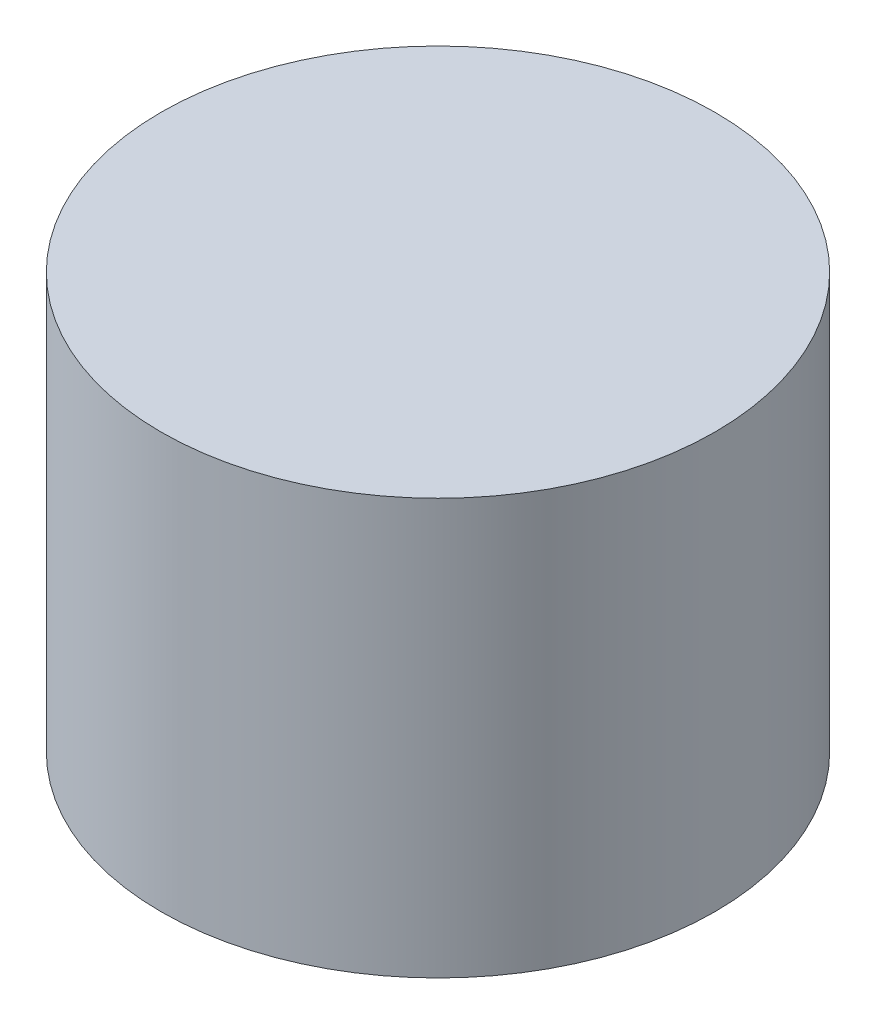
ISO-10303-21;
HEADER;
FILE_DESCRIPTION(('STEP AP214'),'2;1');
FILE_NAME('part.step','',(''),(''),'','','');
FILE_SCHEMA(('AUTOMOTIVE_DESIGN { 1 0 10303 214 1 1 1 1 }'));
ENDSEC;
DATA;
#1=APPLICATION_CONTEXT('core data for automotive mechanical design processes');
#2=APPLICATION_PROTOCOL_DEFINITION('international standard','automotive_design',2000,#1);
#3=PRODUCT_CONTEXT('',#1,'mechanical');
#4=PRODUCT('Part','Part','',(#3));
#5=PRODUCT_RELATED_PRODUCT_CATEGORY('part','',(#4));
#6=PRODUCT_DEFINITION_FORMATION('','',#4);
#7=PRODUCT_DEFINITION_CONTEXT('part definition',#1,'design');
#8=PRODUCT_DEFINITION('design','',#6,#7);
#9=PRODUCT_DEFINITION_SHAPE('','',#8);
#10=(LENGTH_UNIT() NAMED_UNIT(*) SI_UNIT(.MILLI.,.METRE.));
#11=(NAMED_UNIT(*) PLANE_ANGLE_UNIT() SI_UNIT($,.RADIAN.));
#12=(NAMED_UNIT(*) SI_UNIT($,.STERADIAN.) SOLID_ANGLE_UNIT());
#13=UNCERTAINTY_MEASURE_WITH_UNIT(LENGTH_MEASURE(1.E-05),#10,'distance_accuracy_value','');
#14=(GEOMETRIC_REPRESENTATION_CONTEXT(3) GLOBAL_UNCERTAINTY_ASSIGNED_CONTEXT((#13)) GLOBAL_UNIT_ASSIGNED_CONTEXT((#10,
#11,#12)) REPRESENTATION_CONTEXT('',''));
#15=CARTESIAN_POINT('',(0.,0.,0.));
#16=DIRECTION('',(0.,0.,1.));
#17=DIRECTION('',(1.,0.,0.));
#18=AXIS2_PLACEMENT_3D('',#15,#16,#17);
#19=CARTESIAN_POINT('',(500.,1790.,-300.));
#20=DIRECTION('',(0.,-1.,0.));
#21=DIRECTION('',(0.,0.,-1.));
#22=AXIS2_PLACEMENT_3D('',#19,#20,#21);
#23=CYLINDRICAL_SURFACE('',#22,60.0000000000001);
#24=CARTESIAN_POINT('',(500.,1790.,-300.));
#25=DIRECTION('',(0.,1.,0.));
#26=DIRECTION('',(0.,0.,1.));
#27=AXIS2_PLACEMENT_3D('',#24,#25,#26);
#28=CIRCLE('',#27,60.0000000000001);
#29=CARTESIAN_POINT('',(500.,1790.,-360.));
#30=VERTEX_POINT('',#29);
#31=EDGE_CURVE('E10',#30,#30,#28,.T.);
#32=CARTESIAN_POINT('',(500.,1700.,-300.));
#33=DIRECTION('',(0.,1.,0.));
#34=DIRECTION('',(0.,0.,1.));
#35=AXIS2_PLACEMENT_3D('',#32,#33,#34);
#36=CIRCLE('',#35,60.0000000000001);
#37=CARTESIAN_POINT('',(500.,1700.,-360.));
#38=VERTEX_POINT('',#37);
#39=EDGE_CURVE('E40',#38,#38,#36,.T.);
#40=CARTESIAN_POINT('',(500.,1790.,-360.));
#41=CARTESIAN_POINT('',(500.,1789.0625,-360.));
#42=CARTESIAN_POINT('',(500.,1788.125,-360.));
#43=CARTESIAN_POINT('',(500.,1786.25,-360.));
#44=CARTESIAN_POINT('',(500.,1785.3125,-360.));
#45=CARTESIAN_POINT('',(500.,1783.4375,-360.));
#46=CARTESIAN_POINT('',(500.,1782.5,-360.));
#47=CARTESIAN_POINT('',(500.,1780.625,-360.));
#48=CARTESIAN_POINT('',(500.,1779.6875,-360.));
#49=CARTESIAN_POINT('',(500.,1777.8125,-360.));
#50=CARTESIAN_POINT('',(500.,1776.875,-360.));
#51=CARTESIAN_POINT('',(500.,1775.,-360.));
#52=CARTESIAN_POINT('',(500.,1774.0625,-360.));
#53=CARTESIAN_POINT('',(500.,1772.1875,-360.));
#54=CARTESIAN_POINT('',(500.,1771.25,-360.));
#55=CARTESIAN_POINT('',(500.,1769.375,-360.));
#56=CARTESIAN_POINT('',(500.,1768.4375,-360.));
#57=CARTESIAN_POINT('',(500.,1766.5625,-360.));
#58=CARTESIAN_POINT('',(500.,1765.625,-360.));
#59=CARTESIAN_POINT('',(500.,1763.75,-360.));
#60=CARTESIAN_POINT('',(500.,1762.8125,-360.));
#61=CARTESIAN_POINT('',(500.,1760.9375,-360.));
#62=CARTESIAN_POINT('',(500.,1760.,-360.));
#63=CARTESIAN_POINT('',(500.,1758.125,-360.));
#64=CARTESIAN_POINT('',(500.,1757.1875,-360.));
#65=CARTESIAN_POINT('',(500.,1755.3125,-360.));
#66=CARTESIAN_POINT('',(500.,1754.375,-360.));
#67=CARTESIAN_POINT('',(500.,1752.5,-360.));
#68=CARTESIAN_POINT('',(500.,1751.5625,-360.));
#69=CARTESIAN_POINT('',(500.,1749.6875,-360.));
#70=CARTESIAN_POINT('',(500.,1748.75,-360.));
#71=CARTESIAN_POINT('',(500.,1746.875,-360.));
#72=CARTESIAN_POINT('',(500.,1745.9375,-360.));
#73=CARTESIAN_POINT('',(500.,1744.0625,-360.));
#74=CARTESIAN_POINT('',(500.,1743.125,-360.));
#75=CARTESIAN_POINT('',(500.,1741.25,-360.));
#76=CARTESIAN_POINT('',(500.,1740.3125,-360.));
#77=CARTESIAN_POINT('',(500.,1738.4375,-360.));
#78=CARTESIAN_POINT('',(500.,1737.5,-360.));
#79=CARTESIAN_POINT('',(500.,1735.625,-360.));
#80=CARTESIAN_POINT('',(500.,1734.6875,-360.));
#81=CARTESIAN_POINT('',(500.,1732.8125,-360.));
#82=CARTESIAN_POINT('',(500.,1731.875,-360.));
#83=CARTESIAN_POINT('',(500.,1730.,-360.));
#84=CARTESIAN_POINT('',(500.,1729.0625,-360.));
#85=CARTESIAN_POINT('',(500.,1727.1875,-360.));
#86=CARTESIAN_POINT('',(500.,1726.25,-360.));
#87=CARTESIAN_POINT('',(500.,1724.375,-360.));
#88=CARTESIAN_POINT('',(500.,1723.4375,-360.));
#89=CARTESIAN_POINT('',(500.,1721.5625,-360.));
#90=CARTESIAN_POINT('',(500.,1720.625,-360.));
#91=CARTESIAN_POINT('',(500.,1718.75,-360.));
#92=CARTESIAN_POINT('',(500.,1717.8125,-360.));
#93=CARTESIAN_POINT('',(500.,1715.9375,-360.));
#94=CARTESIAN_POINT('',(500.,1715.,-360.));
#95=CARTESIAN_POINT('',(500.,1713.125,-360.));
#96=CARTESIAN_POINT('',(500.,1712.1875,-360.));
#97=CARTESIAN_POINT('',(500.,1710.3125,-360.));
#98=CARTESIAN_POINT('',(500.,1709.375,-360.));
#99=CARTESIAN_POINT('',(500.,1707.5,-360.));
#100=CARTESIAN_POINT('',(500.,1706.5625,-360.));
#101=CARTESIAN_POINT('',(500.,1704.6875,-360.));
#102=CARTESIAN_POINT('',(500.,1703.75,-360.));
#103=CARTESIAN_POINT('',(500.,1701.875,-360.));
#104=CARTESIAN_POINT('',(500.,1700.9375,-360.));
#105=CARTESIAN_POINT('',(500.,1700.,-360.));
#106=B_SPLINE_CURVE_WITH_KNOTS('',3,(#40,#41,#42,#43,#44,#45,#46,#47,#48,#49,#50,#51,#52,#53,
#54,#55,#56,#57,#58,#59,#60,#61,#62,#63,#64,#65,#66,#67,#68,#69,#70,#71,#72,#73,#74,#75,#76,#77,
#78,#79,#80,#81,#82,#83,#84,#85,#86,#87,#88,#89,#90,#91,#92,#93,#94,#95,#96,#97,#98,#99,#100,
#101,#102,#103,#104,#105),.UNSPECIFIED.,.F.,.F.,(4,2,2,2,2,2,2,2,2,2,2,2,2,2,2,2,2,2,2,2,2,2,2,
2,2,2,2,2,2,2,2,2,4),(0.,2.81249999999988,5.62499999999999,8.43749999999988,11.25,
14.0624999999999,16.875,19.6874999999999,22.5,25.3124999999999,28.125,30.9374999999998,
33.7499999999999,36.5624999999998,39.3749999999999,42.1874999999998,44.9999999999999,
47.8124999999998,50.6249999999999,53.4375,56.2499999999999,59.0625,61.8749999999999,64.6875,
67.4999999999999,70.3125,73.1249999999999,75.9375,78.7499999999999,81.5625,84.3749999999999,
87.1875,89.9999999999999),.UNSPECIFIED.);
#107=EDGE_CURVE('BSEAM37',#30,#38,#106,.T.);
#108=ORIENTED_EDGE('',*,*,#31,.F.);
#109=ORIENTED_EDGE('',*,*,#39,.T.);
#110=ORIENTED_EDGE('',*,*,#107,.T.);
#111=ORIENTED_EDGE('',*,*,#107,.F.);
#112=EDGE_LOOP('',(#108,#110,#109,#111));
#113=FACE_BOUND('',#112,.T.);
#114=ADVANCED_FACE('F37',(#113),#23,.T.);
#115=CARTESIAN_POINT('',(500.,1790.,-300.));
#116=DIRECTION('',(0.,1.,0.));
#117=DIRECTION('',(0.,0.,1.));
#118=AXIS2_PLACEMENT_3D('',#115,#116,#117);
#119=PLANE('',#118);
#120=ORIENTED_EDGE('',*,*,#31,.T.);
#121=EDGE_LOOP('',(#120));
#122=FACE_BOUND('',#121,.T.);
#123=ADVANCED_FACE('F52',(#122),#119,.T.);
#124=CARTESIAN_POINT('',(500.,1700.,-300.));
#125=DIRECTION('',(0.,1.,0.));
#126=DIRECTION('',(0.,0.,1.));
#127=AXIS2_PLACEMENT_3D('',#124,#125,#126);
#128=PLANE('',#127);
#129=ORIENTED_EDGE('',*,*,#39,.F.);
#130=EDGE_LOOP('',(#129));
#131=FACE_BOUND('',#130,.T.);
#132=ADVANCED_FACE('F50',(#131),#128,.F.);
#133=CLOSED_SHELL('',(#114,#123,#132));
#134=MANIFOLD_SOLID_BREP('B2',#133);
#135=ADVANCED_BREP_SHAPE_REPRESENTATION('',(#18,#134),#14);
#136=SHAPE_DEFINITION_REPRESENTATION(#9,#135);
ENDSEC;
END-ISO-10303-21;
